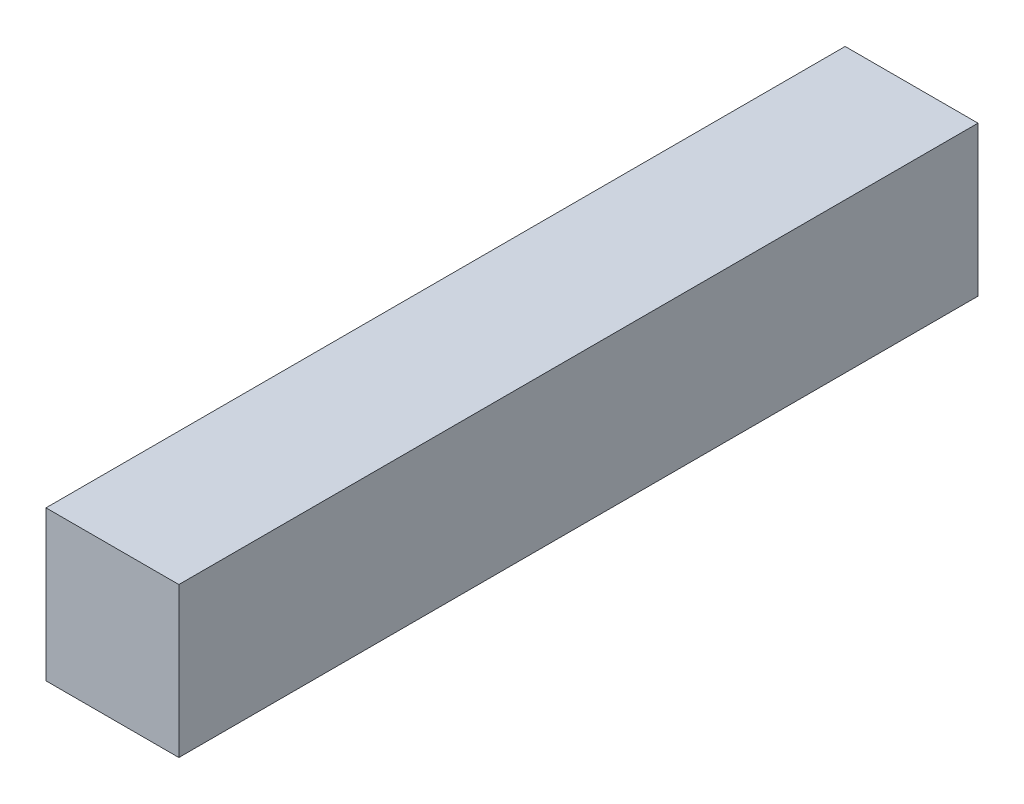
ISO-10303-21;
HEADER;
FILE_DESCRIPTION(('STEP AP214'),'2;1');
FILE_NAME('part.step','',(''),(''),'','','');
FILE_SCHEMA(('AUTOMOTIVE_DESIGN { 1 0 10303 214 1 1 1 1 }'));
ENDSEC;
DATA;
#1=APPLICATION_CONTEXT('core data for automotive mechanical design processes');
#2=APPLICATION_PROTOCOL_DEFINITION('international standard','automotive_design',2000,#1);
#3=PRODUCT_CONTEXT('',#1,'mechanical');
#4=PRODUCT('Part','Part','',(#3));
#5=PRODUCT_RELATED_PRODUCT_CATEGORY('part','',(#4));
#6=PRODUCT_DEFINITION_FORMATION('','',#4);
#7=PRODUCT_DEFINITION_CONTEXT('part definition',#1,'design');
#8=PRODUCT_DEFINITION('design','',#6,#7);
#9=PRODUCT_DEFINITION_SHAPE('','',#8);
#10=(LENGTH_UNIT() NAMED_UNIT(*) SI_UNIT(.MILLI.,.METRE.));
#11=(NAMED_UNIT(*) PLANE_ANGLE_UNIT() SI_UNIT($,.RADIAN.));
#12=(NAMED_UNIT(*) SI_UNIT($,.STERADIAN.) SOLID_ANGLE_UNIT());
#13=UNCERTAINTY_MEASURE_WITH_UNIT(LENGTH_MEASURE(1.E-05),#10,'distance_accuracy_value','');
#14=(GEOMETRIC_REPRESENTATION_CONTEXT(3) GLOBAL_UNCERTAINTY_ASSIGNED_CONTEXT((#13)) GLOBAL_UNIT_ASSIGNED_CONTEXT((#10,
#11,#12)) REPRESENTATION_CONTEXT('',''));
#15=CARTESIAN_POINT('',(0.,0.,0.));
#16=DIRECTION('',(0.,0.,1.));
#17=DIRECTION('',(1.,0.,0.));
#18=AXIS2_PLACEMENT_3D('',#15,#16,#17);
#19=CARTESIAN_POINT('',(0.,0.,80.));
#20=DIRECTION('',(1.,0.,0.));
#21=DIRECTION('',(0.,0.,-1.));
#22=AXIS2_PLACEMENT_3D('',#19,#20,#21);
#23=PLANE('',#22);
#24=DIRECTION('',(0.,-1.,0.));
#25=VECTOR('',#24,1.);
#26=CARTESIAN_POINT('',(0.,0.,0.));
#27=LINE('',#26,#25);
#28=CARTESIAN_POINT('',(0.,15.,0.));
#29=VERTEX_POINT('',#28);
#30=CARTESIAN_POINT('',(0.,0.,0.));
#31=VERTEX_POINT('',#30);
#32=EDGE_CURVE('E100',#29,#31,#27,.T.);
#33=ORIENTED_EDGE('',*,*,#32,.T.);
#34=DIRECTION('',(0.,0.,-1.));
#35=VECTOR('',#34,1.);
#36=CARTESIAN_POINT('',(0.,0.,80.));
#37=LINE('',#36,#35);
#38=CARTESIAN_POINT('',(0.,0.,80.));
#39=VERTEX_POINT('',#38);
#40=EDGE_CURVE('E11',#39,#31,#37,.T.);
#41=ORIENTED_EDGE('',*,*,#40,.F.);
#42=DIRECTION('',(0.,-1.,0.));
#43=VECTOR('',#42,1.);
#44=CARTESIAN_POINT('',(0.,0.,80.));
#45=LINE('',#44,#43);
#46=CARTESIAN_POINT('',(0.,15.,80.));
#47=VERTEX_POINT('',#46);
#48=EDGE_CURVE('E88',#47,#39,#45,.T.);
#49=ORIENTED_EDGE('',*,*,#48,.F.);
#50=DIRECTION('',(0.,0.,-1.));
#51=VECTOR('',#50,1.);
#52=CARTESIAN_POINT('',(0.,15.,80.));
#53=LINE('',#52,#51);
#54=EDGE_CURVE('E96',#47,#29,#53,.T.);
#55=ORIENTED_EDGE('',*,*,#54,.T.);
#56=EDGE_LOOP('',(#33,#41,#49,#55));
#57=FACE_BOUND('',#56,.T.);
#58=ADVANCED_FACE('F37',(#57),#23,.F.);
#59=CARTESIAN_POINT('',(0.,0.,80.));
#60=DIRECTION('',(0.,1.,0.));
#61=DIRECTION('',(0.,0.,1.));
#62=AXIS2_PLACEMENT_3D('',#59,#60,#61);
#63=PLANE('',#62);
#64=DIRECTION('',(1.,0.,0.));
#65=VECTOR('',#64,1.);
#66=CARTESIAN_POINT('',(0.,0.,0.));
#67=LINE('',#66,#65);
#68=CARTESIAN_POINT('',(13.3,0.,0.));
#69=VERTEX_POINT('',#68);
#70=EDGE_CURVE('E92',#31,#69,#67,.T.);
#71=ORIENTED_EDGE('',*,*,#70,.T.);
#72=DIRECTION('',(0.,0.,-1.));
#73=VECTOR('',#72,1.);
#74=CARTESIAN_POINT('',(13.3,0.,80.));
#75=LINE('',#74,#73);
#76=CARTESIAN_POINT('',(13.3,0.,80.));
#77=VERTEX_POINT('',#76);
#78=EDGE_CURVE('E45',#77,#69,#75,.T.);
#79=ORIENTED_EDGE('',*,*,#78,.F.);
#80=DIRECTION('',(1.,0.,0.));
#81=VECTOR('',#80,1.);
#82=CARTESIAN_POINT('',(0.,0.,80.));
#83=LINE('',#82,#81);
#84=EDGE_CURVE('E83',#39,#77,#83,.T.);
#85=ORIENTED_EDGE('',*,*,#84,.F.);
#86=ORIENTED_EDGE('',*,*,#40,.T.);
#87=EDGE_LOOP('',(#71,#79,#85,#86));
#88=FACE_BOUND('',#87,.T.);
#89=ADVANCED_FACE('F91',(#88),#63,.F.);
#90=CARTESIAN_POINT('',(13.3,0.,80.));
#91=DIRECTION('',(-1.,0.,0.));
#92=DIRECTION('',(0.,-1.,0.));
#93=AXIS2_PLACEMENT_3D('',#90,#91,#92);
#94=PLANE('',#93);
#95=DIRECTION('',(0.,1.,0.));
#96=VECTOR('',#95,1.);
#97=CARTESIAN_POINT('',(13.3,0.,0.));
#98=LINE('',#97,#96);
#99=CARTESIAN_POINT('',(13.3,15.,0.));
#100=VERTEX_POINT('',#99);
#101=EDGE_CURVE('E70',#69,#100,#98,.T.);
#102=ORIENTED_EDGE('',*,*,#101,.T.);
#103=DIRECTION('',(0.,0.,-1.));
#104=VECTOR('',#103,1.);
#105=CARTESIAN_POINT('',(13.3,15.,80.));
#106=LINE('',#105,#104);
#107=CARTESIAN_POINT('',(13.3,15.,80.));
#108=VERTEX_POINT('',#107);
#109=EDGE_CURVE('E93',#108,#100,#106,.T.);
#110=ORIENTED_EDGE('',*,*,#109,.F.);
#111=DIRECTION('',(0.,1.,0.));
#112=VECTOR('',#111,1.);
#113=CARTESIAN_POINT('',(13.3,0.,80.));
#114=LINE('',#113,#112);
#115=EDGE_CURVE('E86',#77,#108,#114,.T.);
#116=ORIENTED_EDGE('',*,*,#115,.F.);
#117=ORIENTED_EDGE('',*,*,#78,.T.);
#118=EDGE_LOOP('',(#102,#110,#116,#117));
#119=FACE_BOUND('',#118,.T.);
#120=ADVANCED_FACE('F94',(#119),#94,.F.);
#121=CARTESIAN_POINT('',(0.,15.,80.));
#122=DIRECTION('',(0.,-1.,0.));
#123=DIRECTION('',(0.,0.,-1.));
#124=AXIS2_PLACEMENT_3D('',#121,#122,#123);
#125=PLANE('',#124);
#126=DIRECTION('',(-1.,0.,0.));
#127=VECTOR('',#126,1.);
#128=CARTESIAN_POINT('',(0.,15.,0.));
#129=LINE('',#128,#127);
#130=EDGE_CURVE('E76',#100,#29,#129,.T.);
#131=ORIENTED_EDGE('',*,*,#130,.T.);
#132=ORIENTED_EDGE('',*,*,#54,.F.);
#133=DIRECTION('',(-1.,0.,0.));
#134=VECTOR('',#133,1.);
#135=CARTESIAN_POINT('',(0.,15.,80.));
#136=LINE('',#135,#134);
#137=EDGE_CURVE('E53',#108,#47,#136,.T.);
#138=ORIENTED_EDGE('',*,*,#137,.F.);
#139=ORIENTED_EDGE('',*,*,#109,.T.);
#140=EDGE_LOOP('',(#131,#132,#138,#139));
#141=FACE_BOUND('',#140,.T.);
#142=ADVANCED_FACE('F107',(#141),#125,.F.);
#143=CARTESIAN_POINT('',(0.,0.,80.));
#144=DIRECTION('',(0.,0.,-1.));
#145=DIRECTION('',(-1.,0.,0.));
#146=AXIS2_PLACEMENT_3D('',#143,#144,#145);
#147=PLANE('',#146);
#148=ORIENTED_EDGE('',*,*,#48,.T.);
#149=ORIENTED_EDGE('',*,*,#84,.T.);
#150=ORIENTED_EDGE('',*,*,#115,.T.);
#151=ORIENTED_EDGE('',*,*,#137,.T.);
#152=EDGE_LOOP('',(#148,#149,#150,#151));
#153=FACE_BOUND('',#152,.T.);
#154=ADVANCED_FACE('F84',(#153),#147,.F.);
#155=CARTESIAN_POINT('',(0.,0.,0.));
#156=DIRECTION('',(0.,0.,-1.));
#157=DIRECTION('',(-1.,0.,0.));
#158=AXIS2_PLACEMENT_3D('',#155,#156,#157);
#159=PLANE('',#158);
#160=ORIENTED_EDGE('',*,*,#32,.F.);
#161=ORIENTED_EDGE('',*,*,#130,.F.);
#162=ORIENTED_EDGE('',*,*,#101,.F.);
#163=ORIENTED_EDGE('',*,*,#70,.F.);
#164=EDGE_LOOP('',(#160,#161,#162,#163));
#165=FACE_BOUND('',#164,.T.);
#166=ADVANCED_FACE('F110',(#165),#159,.T.);
#167=CLOSED_SHELL('',(#58,#89,#120,#142,#154,#166));
#168=MANIFOLD_SOLID_BREP('B2',#167);
#169=ADVANCED_BREP_SHAPE_REPRESENTATION('',(#18,#168),#14);
#170=SHAPE_DEFINITION_REPRESENTATION(#9,#169);
ENDSEC;
END-ISO-10303-21;
